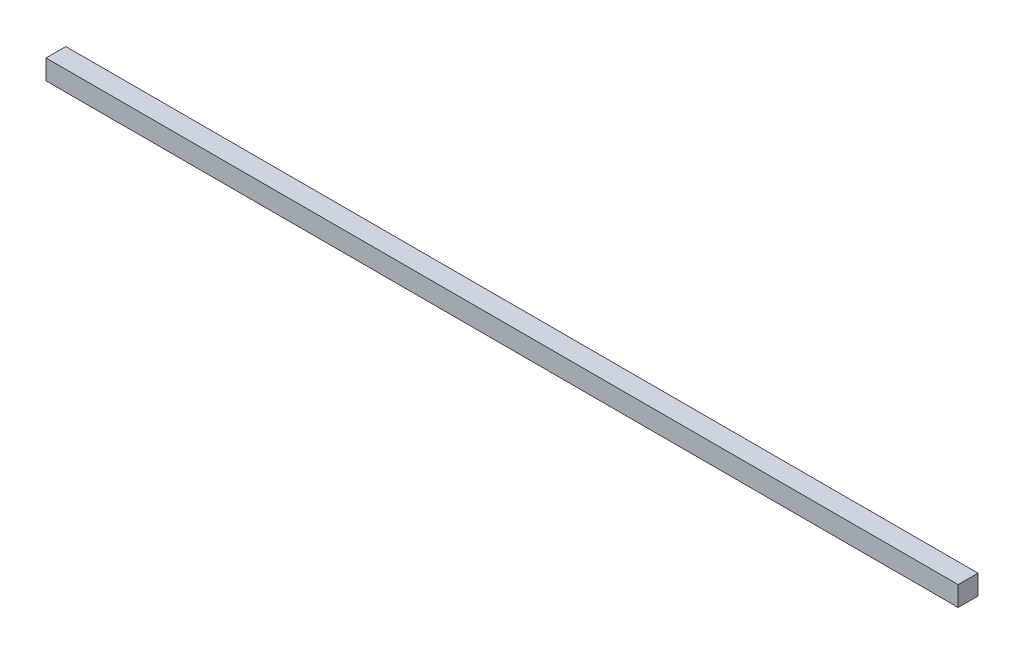
ISO-10303-21;
HEADER;
FILE_DESCRIPTION(('STEP AP214'),'2;1');
FILE_NAME('part.step','',(''),(''),'','','');
FILE_SCHEMA(('AUTOMOTIVE_DESIGN { 1 0 10303 214 1 1 1 1 }'));
ENDSEC;
DATA;
#1=APPLICATION_CONTEXT('core data for automotive mechanical design processes');
#2=APPLICATION_PROTOCOL_DEFINITION('international standard','automotive_design',2000,#1);
#3=PRODUCT_CONTEXT('',#1,'mechanical');
#4=PRODUCT('Part','Part','',(#3));
#5=PRODUCT_RELATED_PRODUCT_CATEGORY('part','',(#4));
#6=PRODUCT_DEFINITION_FORMATION('','',#4);
#7=PRODUCT_DEFINITION_CONTEXT('part definition',#1,'design');
#8=PRODUCT_DEFINITION('design','',#6,#7);
#9=PRODUCT_DEFINITION_SHAPE('','',#8);
#10=(LENGTH_UNIT() NAMED_UNIT(*) SI_UNIT(.MILLI.,.METRE.));
#11=(NAMED_UNIT(*) PLANE_ANGLE_UNIT() SI_UNIT($,.RADIAN.));
#12=(NAMED_UNIT(*) SI_UNIT($,.STERADIAN.) SOLID_ANGLE_UNIT());
#13=UNCERTAINTY_MEASURE_WITH_UNIT(LENGTH_MEASURE(1.E-05),#10,'distance_accuracy_value','');
#14=(GEOMETRIC_REPRESENTATION_CONTEXT(3) GLOBAL_UNCERTAINTY_ASSIGNED_CONTEXT((#13)) GLOBAL_UNIT_ASSIGNED_CONTEXT((#10,
#11,#12)) REPRESENTATION_CONTEXT('',''));
#15=CARTESIAN_POINT('',(0.,0.,0.));
#16=DIRECTION('',(0.,0.,1.));
#17=DIRECTION('',(1.,0.,0.));
#18=AXIS2_PLACEMENT_3D('',#15,#16,#17);
#19=CARTESIAN_POINT('',(1168.4,12.7,-12.7));
#20=DIRECTION('',(0.,0.,1.));
#21=DIRECTION('',(0.,-1.,0.));
#22=AXIS2_PLACEMENT_3D('',#19,#20,#21);
#23=PLANE('',#22);
#24=DIRECTION('',(0.,1.,0.));
#25=VECTOR('',#24,1.);
#26=CARTESIAN_POINT('',(0.,12.7,-12.7));
#27=LINE('',#26,#25);
#28=CARTESIAN_POINT('',(0.,-12.7,-12.7));
#29=VERTEX_POINT('',#28);
#30=CARTESIAN_POINT('',(0.,12.7,-12.7));
#31=VERTEX_POINT('',#30);
#32=EDGE_CURVE('E107',#29,#31,#27,.T.);
#33=ORIENTED_EDGE('',*,*,#32,.T.);
#34=DIRECTION('',(-1.,0.,0.));
#35=VECTOR('',#34,1.);
#36=CARTESIAN_POINT('',(1168.4,12.7,-12.7));
#37=LINE('',#36,#35);
#38=CARTESIAN_POINT('',(1168.4,12.7,-12.7));
#39=VERTEX_POINT('',#38);
#40=EDGE_CURVE('E11',#39,#31,#37,.T.);
#41=ORIENTED_EDGE('',*,*,#40,.F.);
#42=DIRECTION('',(0.,1.,0.));
#43=VECTOR('',#42,1.);
#44=CARTESIAN_POINT('',(1168.4,12.7,-12.7));
#45=LINE('',#44,#43);
#46=CARTESIAN_POINT('',(1168.4,-12.7,-12.7));
#47=VERTEX_POINT('',#46);
#48=EDGE_CURVE('E91',#47,#39,#45,.T.);
#49=ORIENTED_EDGE('',*,*,#48,.F.);
#50=DIRECTION('',(-1.,0.,0.));
#51=VECTOR('',#50,1.);
#52=CARTESIAN_POINT('',(1168.4,-12.7,-12.7));
#53=LINE('',#52,#51);
#54=EDGE_CURVE('E103',#47,#29,#53,.T.);
#55=ORIENTED_EDGE('',*,*,#54,.T.);
#56=EDGE_LOOP('',(#33,#41,#49,#55));
#57=FACE_BOUND('',#56,.T.);
#58=ADVANCED_FACE('F39',(#57),#23,.F.);
#59=CARTESIAN_POINT('',(1168.4,12.7,12.7));
#60=DIRECTION('',(0.,-1.,0.));
#61=DIRECTION('',(0.,0.,-1.));
#62=AXIS2_PLACEMENT_3D('',#59,#60,#61);
#63=PLANE('',#62);
#64=DIRECTION('',(0.,0.,1.));
#65=VECTOR('',#64,1.);
#66=CARTESIAN_POINT('',(0.,12.7,12.7));
#67=LINE('',#66,#65);
#68=CARTESIAN_POINT('',(0.,12.7,12.7));
#69=VERTEX_POINT('',#68);
#70=EDGE_CURVE('E96',#31,#69,#67,.T.);
#71=ORIENTED_EDGE('',*,*,#70,.T.);
#72=DIRECTION('',(-1.,0.,0.));
#73=VECTOR('',#72,1.);
#74=CARTESIAN_POINT('',(1168.4,12.7,12.7));
#75=LINE('',#74,#73);
#76=CARTESIAN_POINT('',(1168.4,12.7,12.7));
#77=VERTEX_POINT('',#76);
#78=EDGE_CURVE('E48',#77,#69,#75,.T.);
#79=ORIENTED_EDGE('',*,*,#78,.F.);
#80=DIRECTION('',(0.,0.,1.));
#81=VECTOR('',#80,1.);
#82=CARTESIAN_POINT('',(1168.4,12.7,12.7));
#83=LINE('',#82,#81);
#84=EDGE_CURVE('E86',#39,#77,#83,.T.);
#85=ORIENTED_EDGE('',*,*,#84,.F.);
#86=ORIENTED_EDGE('',*,*,#40,.T.);
#87=EDGE_LOOP('',(#71,#79,#85,#86));
#88=FACE_BOUND('',#87,.T.);
#89=ADVANCED_FACE('F95',(#88),#63,.F.);
#90=CARTESIAN_POINT('',(1168.4,12.7,12.7));
#91=DIRECTION('',(0.,0.,-1.));
#92=DIRECTION('',(0.,1.,0.));
#93=AXIS2_PLACEMENT_3D('',#90,#91,#92);
#94=PLANE('',#93);
#95=DIRECTION('',(0.,-1.,0.));
#96=VECTOR('',#95,1.);
#97=CARTESIAN_POINT('',(0.,12.7,12.7));
#98=LINE('',#97,#96);
#99=CARTESIAN_POINT('',(0.,-12.7,12.7));
#100=VERTEX_POINT('',#99);
#101=EDGE_CURVE('E73',#69,#100,#98,.T.);
#102=ORIENTED_EDGE('',*,*,#101,.T.);
#103=DIRECTION('',(-1.,0.,0.));
#104=VECTOR('',#103,1.);
#105=CARTESIAN_POINT('',(1168.4,-12.7,12.7));
#106=LINE('',#105,#104);
#107=CARTESIAN_POINT('',(1168.4,-12.7,12.7));
#108=VERTEX_POINT('',#107);
#109=EDGE_CURVE('E98',#108,#100,#106,.T.);
#110=ORIENTED_EDGE('',*,*,#109,.F.);
#111=DIRECTION('',(0.,-1.,0.));
#112=VECTOR('',#111,1.);
#113=CARTESIAN_POINT('',(1168.4,12.7,12.7));
#114=LINE('',#113,#112);
#115=EDGE_CURVE('E89',#77,#108,#114,.T.);
#116=ORIENTED_EDGE('',*,*,#115,.F.);
#117=ORIENTED_EDGE('',*,*,#78,.T.);
#118=EDGE_LOOP('',(#102,#110,#116,#117));
#119=FACE_BOUND('',#118,.T.);
#120=ADVANCED_FACE('F99',(#119),#94,.F.);
#121=CARTESIAN_POINT('',(1168.4,-12.7,12.7));
#122=DIRECTION('',(0.,1.,0.));
#123=DIRECTION('',(0.,0.,1.));
#124=AXIS2_PLACEMENT_3D('',#121,#122,#123);
#125=PLANE('',#124);
#126=DIRECTION('',(0.,0.,-1.));
#127=VECTOR('',#126,1.);
#128=CARTESIAN_POINT('',(0.,-12.7,12.7));
#129=LINE('',#128,#127);
#130=EDGE_CURVE('E79',#100,#29,#129,.T.);
#131=ORIENTED_EDGE('',*,*,#130,.T.);
#132=ORIENTED_EDGE('',*,*,#54,.F.);
#133=DIRECTION('',(0.,0.,-1.));
#134=VECTOR('',#133,1.);
#135=CARTESIAN_POINT('',(1168.4,-12.7,12.7));
#136=LINE('',#135,#134);
#137=EDGE_CURVE('E56',#108,#47,#136,.T.);
#138=ORIENTED_EDGE('',*,*,#137,.F.);
#139=ORIENTED_EDGE('',*,*,#109,.T.);
#140=EDGE_LOOP('',(#131,#132,#138,#139));
#141=FACE_BOUND('',#140,.T.);
#142=ADVANCED_FACE('F120',(#141),#125,.F.);
#143=CARTESIAN_POINT('',(1168.4,0.,0.));
#144=DIRECTION('',(1.,0.,0.));
#145=DIRECTION('',(0.,0.,-1.));
#146=AXIS2_PLACEMENT_3D('',#143,#144,#145);
#147=PLANE('',#146);
#148=ORIENTED_EDGE('',*,*,#48,.T.);
#149=ORIENTED_EDGE('',*,*,#84,.T.);
#150=ORIENTED_EDGE('',*,*,#115,.T.);
#151=ORIENTED_EDGE('',*,*,#137,.T.);
#152=EDGE_LOOP('',(#148,#149,#150,#151));
#153=FACE_BOUND('',#152,.T.);
#154=ADVANCED_FACE('F87',(#153),#147,.T.);
#155=CARTESIAN_POINT('',(0.,0.,0.));
#156=DIRECTION('',(1.,0.,0.));
#157=DIRECTION('',(0.,0.,-1.));
#158=AXIS2_PLACEMENT_3D('',#155,#156,#157);
#159=PLANE('',#158);
#160=ORIENTED_EDGE('',*,*,#32,.F.);
#161=ORIENTED_EDGE('',*,*,#130,.F.);
#162=ORIENTED_EDGE('',*,*,#101,.F.);
#163=ORIENTED_EDGE('',*,*,#70,.F.);
#164=EDGE_LOOP('',(#160,#161,#162,#163));
#165=FACE_BOUND('',#164,.T.);
#166=ADVANCED_FACE('F123',(#165),#159,.F.);
#167=CLOSED_SHELL('',(#58,#89,#120,#142,#154,#166));
#168=MANIFOLD_SOLID_BREP('B2',#167);
#169=ADVANCED_BREP_SHAPE_REPRESENTATION('',(#18,#168),#14);
#170=SHAPE_DEFINITION_REPRESENTATION(#9,#169);
ENDSEC;
END-ISO-10303-21;
